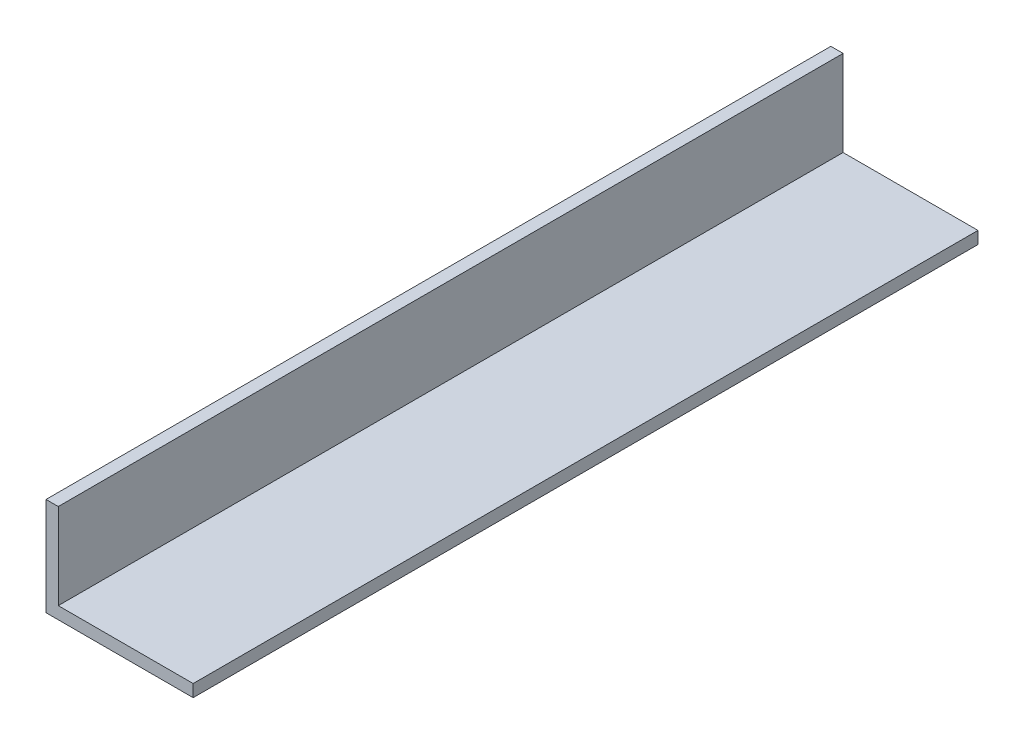
ISO-10303-21;
HEADER;
FILE_DESCRIPTION(('STEP AP214'),'2;1');
FILE_NAME('part.step','',(''),(''),'','','');
FILE_SCHEMA(('AUTOMOTIVE_DESIGN { 1 0 10303 214 1 1 1 1 }'));
ENDSEC;
DATA;
#1=APPLICATION_CONTEXT('core data for automotive mechanical design processes');
#2=APPLICATION_PROTOCOL_DEFINITION('international standard','automotive_design',2000,#1);
#3=PRODUCT_CONTEXT('',#1,'mechanical');
#4=PRODUCT('Part','Part','',(#3));
#5=PRODUCT_RELATED_PRODUCT_CATEGORY('part','',(#4));
#6=PRODUCT_DEFINITION_FORMATION('','',#4);
#7=PRODUCT_DEFINITION_CONTEXT('part definition',#1,'design');
#8=PRODUCT_DEFINITION('design','',#6,#7);
#9=PRODUCT_DEFINITION_SHAPE('','',#8);
#10=(LENGTH_UNIT() NAMED_UNIT(*) SI_UNIT(.MILLI.,.METRE.));
#11=(NAMED_UNIT(*) PLANE_ANGLE_UNIT() SI_UNIT($,.RADIAN.));
#12=(NAMED_UNIT(*) SI_UNIT($,.STERADIAN.) SOLID_ANGLE_UNIT());
#13=UNCERTAINTY_MEASURE_WITH_UNIT(LENGTH_MEASURE(1.E-05),#10,'distance_accuracy_value','');
#14=(GEOMETRIC_REPRESENTATION_CONTEXT(3) GLOBAL_UNCERTAINTY_ASSIGNED_CONTEXT((#13)) GLOBAL_UNIT_ASSIGNED_CONTEXT((#10,
#11,#12)) REPRESENTATION_CONTEXT('',''));
#15=CARTESIAN_POINT('',(0.,0.,0.));
#16=DIRECTION('',(0.,0.,1.));
#17=DIRECTION('',(1.,0.,0.));
#18=AXIS2_PLACEMENT_3D('',#15,#16,#17);
#19=CARTESIAN_POINT('',(0.,12.7,101.6));
#20=DIRECTION('',(1.,0.,0.));
#21=DIRECTION('',(0.,1.,0.));
#22=AXIS2_PLACEMENT_3D('',#19,#20,#21);
#23=PLANE('',#22);
#24=DIRECTION('',(0.,-1.,0.));
#25=VECTOR('',#24,1.);
#26=CARTESIAN_POINT('',(0.,12.7,0.));
#27=LINE('',#26,#25);
#28=CARTESIAN_POINT('',(0.,12.7,0.));
#29=VERTEX_POINT('',#28);
#30=CARTESIAN_POINT('',(0.,0.,0.));
#31=VERTEX_POINT('',#30);
#32=EDGE_CURVE('E116',#29,#31,#27,.T.);
#33=ORIENTED_EDGE('',*,*,#32,.T.);
#34=DIRECTION('',(0.,0.,-1.));
#35=VECTOR('',#34,1.);
#36=CARTESIAN_POINT('',(0.,0.,101.6));
#37=LINE('',#36,#35);
#38=CARTESIAN_POINT('',(0.,0.,101.6));
#39=VERTEX_POINT('',#38);
#40=EDGE_CURVE('E11',#39,#31,#37,.T.);
#41=ORIENTED_EDGE('',*,*,#40,.F.);
#42=DIRECTION('',(0.,-1.,0.));
#43=VECTOR('',#42,1.);
#44=CARTESIAN_POINT('',(0.,12.7,101.6));
#45=LINE('',#44,#43);
#46=CARTESIAN_POINT('',(0.,12.7,101.6));
#47=VERTEX_POINT('',#46);
#48=EDGE_CURVE('E126',#47,#39,#45,.T.);
#49=ORIENTED_EDGE('',*,*,#48,.F.);
#50=DIRECTION('',(0.,0.,-1.));
#51=VECTOR('',#50,1.);
#52=CARTESIAN_POINT('',(0.,12.7,101.6));
#53=LINE('',#52,#51);
#54=EDGE_CURVE('E112',#47,#29,#53,.T.);
#55=ORIENTED_EDGE('',*,*,#54,.T.);
#56=EDGE_LOOP('',(#33,#41,#49,#55));
#57=FACE_BOUND('',#56,.T.);
#58=ADVANCED_FACE('F32',(#57),#23,.F.);
#59=CARTESIAN_POINT('',(0.,0.,101.6));
#60=DIRECTION('',(0.,1.,0.));
#61=DIRECTION('',(0.,0.,1.));
#62=AXIS2_PLACEMENT_3D('',#59,#60,#61);
#63=PLANE('',#62);
#64=DIRECTION('',(1.,0.,0.));
#65=VECTOR('',#64,1.);
#66=CARTESIAN_POINT('',(0.,0.,0.));
#67=LINE('',#66,#65);
#68=CARTESIAN_POINT('',(19.05,0.,0.));
#69=VERTEX_POINT('',#68);
#70=EDGE_CURVE('E119',#31,#69,#67,.T.);
#71=ORIENTED_EDGE('',*,*,#70,.T.);
#72=DIRECTION('',(0.,0.,-1.));
#73=VECTOR('',#72,1.);
#74=CARTESIAN_POINT('',(19.05,0.,101.6));
#75=LINE('',#74,#73);
#76=CARTESIAN_POINT('',(19.05,0.,101.6));
#77=VERTEX_POINT('',#76);
#78=EDGE_CURVE('E40',#77,#69,#75,.T.);
#79=ORIENTED_EDGE('',*,*,#78,.F.);
#80=DIRECTION('',(1.,0.,0.));
#81=VECTOR('',#80,1.);
#82=CARTESIAN_POINT('',(0.,0.,101.6));
#83=LINE('',#82,#81);
#84=EDGE_CURVE('E85',#39,#77,#83,.T.);
#85=ORIENTED_EDGE('',*,*,#84,.F.);
#86=ORIENTED_EDGE('',*,*,#40,.T.);
#87=EDGE_LOOP('',(#71,#79,#85,#86));
#88=FACE_BOUND('',#87,.T.);
#89=ADVANCED_FACE('F150',(#88),#63,.F.);
#90=CARTESIAN_POINT('',(19.05,0.,101.6));
#91=DIRECTION('',(-1.,0.,0.));
#92=DIRECTION('',(0.,0.,1.));
#93=AXIS2_PLACEMENT_3D('',#90,#91,#92);
#94=PLANE('',#93);
#95=DIRECTION('',(0.,1.,0.));
#96=VECTOR('',#95,1.);
#97=CARTESIAN_POINT('',(19.05,0.,0.));
#98=LINE('',#97,#96);
#99=CARTESIAN_POINT('',(19.05,1.5875,0.));
#100=VERTEX_POINT('',#99);
#101=EDGE_CURVE('E121',#69,#100,#98,.T.);
#102=ORIENTED_EDGE('',*,*,#101,.T.);
#103=DIRECTION('',(0.,0.,-1.));
#104=VECTOR('',#103,1.);
#105=CARTESIAN_POINT('',(19.05,1.5875,101.6));
#106=LINE('',#105,#104);
#107=CARTESIAN_POINT('',(19.05,1.5875,101.6));
#108=VERTEX_POINT('',#107);
#109=EDGE_CURVE('E107',#108,#100,#106,.T.);
#110=ORIENTED_EDGE('',*,*,#109,.F.);
#111=DIRECTION('',(0.,1.,0.));
#112=VECTOR('',#111,1.);
#113=CARTESIAN_POINT('',(19.05,0.,101.6));
#114=LINE('',#113,#112);
#115=EDGE_CURVE('E98',#77,#108,#114,.T.);
#116=ORIENTED_EDGE('',*,*,#115,.F.);
#117=ORIENTED_EDGE('',*,*,#78,.T.);
#118=EDGE_LOOP('',(#102,#110,#116,#117));
#119=FACE_BOUND('',#118,.T.);
#120=ADVANCED_FACE('F132',(#119),#94,.F.);
#121=CARTESIAN_POINT('',(19.05,1.5875,101.6));
#122=DIRECTION('',(0.,-1.,0.));
#123=DIRECTION('',(1.,0.,0.));
#124=AXIS2_PLACEMENT_3D('',#121,#122,#123);
#125=PLANE('',#124);
#126=DIRECTION('',(-1.,0.,0.));
#127=VECTOR('',#126,1.);
#128=CARTESIAN_POINT('',(19.05,1.5875,0.));
#129=LINE('',#128,#127);
#130=CARTESIAN_POINT('',(1.5875,1.5875,0.));
#131=VERTEX_POINT('',#130);
#132=EDGE_CURVE('E106',#100,#131,#129,.T.);
#133=ORIENTED_EDGE('',*,*,#132,.T.);
#134=DIRECTION('',(0.,0.,-1.));
#135=VECTOR('',#134,1.);
#136=CARTESIAN_POINT('',(1.5875,1.5875,101.6));
#137=LINE('',#136,#135);
#138=CARTESIAN_POINT('',(1.5875,1.5875,101.6));
#139=VERTEX_POINT('',#138);
#140=EDGE_CURVE('E103',#139,#131,#137,.T.);
#141=ORIENTED_EDGE('',*,*,#140,.F.);
#142=DIRECTION('',(-1.,0.,0.));
#143=VECTOR('',#142,1.);
#144=CARTESIAN_POINT('',(19.05,1.5875,101.6));
#145=LINE('',#144,#143);
#146=EDGE_CURVE('E92',#108,#139,#145,.T.);
#147=ORIENTED_EDGE('',*,*,#146,.F.);
#148=ORIENTED_EDGE('',*,*,#109,.T.);
#149=EDGE_LOOP('',(#133,#141,#147,#148));
#150=FACE_BOUND('',#149,.T.);
#151=ADVANCED_FACE('F104',(#150),#125,.F.);
#152=CARTESIAN_POINT('',(1.5875,1.5875,101.6));
#153=DIRECTION('',(-1.,0.,0.));
#154=DIRECTION('',(0.,-1.,0.));
#155=AXIS2_PLACEMENT_3D('',#152,#153,#154);
#156=PLANE('',#155);
#157=DIRECTION('',(0.,1.,0.));
#158=VECTOR('',#157,1.);
#159=CARTESIAN_POINT('',(1.5875,1.5875,0.));
#160=LINE('',#159,#158);
#161=CARTESIAN_POINT('',(1.5875,12.7,0.));
#162=VERTEX_POINT('',#161);
#163=EDGE_CURVE('E71',#131,#162,#160,.T.);
#164=ORIENTED_EDGE('',*,*,#163,.T.);
#165=DIRECTION('',(0.,0.,-1.));
#166=VECTOR('',#165,1.);
#167=CARTESIAN_POINT('',(1.5875,12.7,101.6));
#168=LINE('',#167,#166);
#169=CARTESIAN_POINT('',(1.5875,12.7,101.6));
#170=VERTEX_POINT('',#169);
#171=EDGE_CURVE('E108',#170,#162,#168,.T.);
#172=ORIENTED_EDGE('',*,*,#171,.F.);
#173=DIRECTION('',(0.,1.,0.));
#174=VECTOR('',#173,1.);
#175=CARTESIAN_POINT('',(1.5875,1.5875,101.6));
#176=LINE('',#175,#174);
#177=EDGE_CURVE('E96',#139,#170,#176,.T.);
#178=ORIENTED_EDGE('',*,*,#177,.F.);
#179=ORIENTED_EDGE('',*,*,#140,.T.);
#180=EDGE_LOOP('',(#164,#172,#178,#179));
#181=FACE_BOUND('',#180,.T.);
#182=ADVANCED_FACE('F110',(#181),#156,.F.);
#183=CARTESIAN_POINT('',(1.5875,12.7,101.6));
#184=DIRECTION('',(0.,-1.,0.));
#185=DIRECTION('',(0.,0.,-1.));
#186=AXIS2_PLACEMENT_3D('',#183,#184,#185);
#187=PLANE('',#186);
#188=DIRECTION('',(-1.,0.,0.));
#189=VECTOR('',#188,1.);
#190=CARTESIAN_POINT('',(1.5875,12.7,0.));
#191=LINE('',#190,#189);
#192=EDGE_CURVE('E77',#162,#29,#191,.T.);
#193=ORIENTED_EDGE('',*,*,#192,.T.);
#194=ORIENTED_EDGE('',*,*,#54,.F.);
#195=DIRECTION('',(-1.,0.,0.));
#196=VECTOR('',#195,1.);
#197=CARTESIAN_POINT('',(1.5875,12.7,101.6));
#198=LINE('',#197,#196);
#199=EDGE_CURVE('E48',#170,#47,#198,.T.);
#200=ORIENTED_EDGE('',*,*,#199,.F.);
#201=ORIENTED_EDGE('',*,*,#171,.T.);
#202=EDGE_LOOP('',(#193,#194,#200,#201));
#203=FACE_BOUND('',#202,.T.);
#204=ADVANCED_FACE('F139',(#203),#187,.F.);
#205=CARTESIAN_POINT('',(0.,0.,101.6));
#206=DIRECTION('',(0.,0.,1.));
#207=DIRECTION('',(1.,0.,0.));
#208=AXIS2_PLACEMENT_3D('',#205,#206,#207);
#209=PLANE('',#208);
#210=ORIENTED_EDGE('',*,*,#48,.T.);
#211=ORIENTED_EDGE('',*,*,#84,.T.);
#212=ORIENTED_EDGE('',*,*,#115,.T.);
#213=ORIENTED_EDGE('',*,*,#146,.T.);
#214=ORIENTED_EDGE('',*,*,#177,.T.);
#215=ORIENTED_EDGE('',*,*,#199,.T.);
#216=EDGE_LOOP('',(#210,#211,#212,#213,#214,#215));
#217=FACE_BOUND('',#216,.T.);
#218=ADVANCED_FACE('F94',(#217),#209,.T.);
#219=CARTESIAN_POINT('',(0.,0.,0.));
#220=DIRECTION('',(0.,0.,1.));
#221=DIRECTION('',(1.,0.,0.));
#222=AXIS2_PLACEMENT_3D('',#219,#220,#221);
#223=PLANE('',#222);
#224=ORIENTED_EDGE('',*,*,#32,.F.);
#225=ORIENTED_EDGE('',*,*,#192,.F.);
#226=ORIENTED_EDGE('',*,*,#163,.F.);
#227=ORIENTED_EDGE('',*,*,#132,.F.);
#228=ORIENTED_EDGE('',*,*,#101,.F.);
#229=ORIENTED_EDGE('',*,*,#70,.F.);
#230=EDGE_LOOP('',(#224,#225,#226,#227,#228,#229));
#231=FACE_BOUND('',#230,.T.);
#232=ADVANCED_FACE('F135',(#231),#223,.F.);
#233=CLOSED_SHELL('',(#58,#89,#120,#151,#182,#204,#218,#232));
#234=MANIFOLD_SOLID_BREP('B2',#233);
#235=ADVANCED_BREP_SHAPE_REPRESENTATION('',(#18,#234),#14);
#236=SHAPE_DEFINITION_REPRESENTATION(#9,#235);
ENDSEC;
END-ISO-10303-21;
